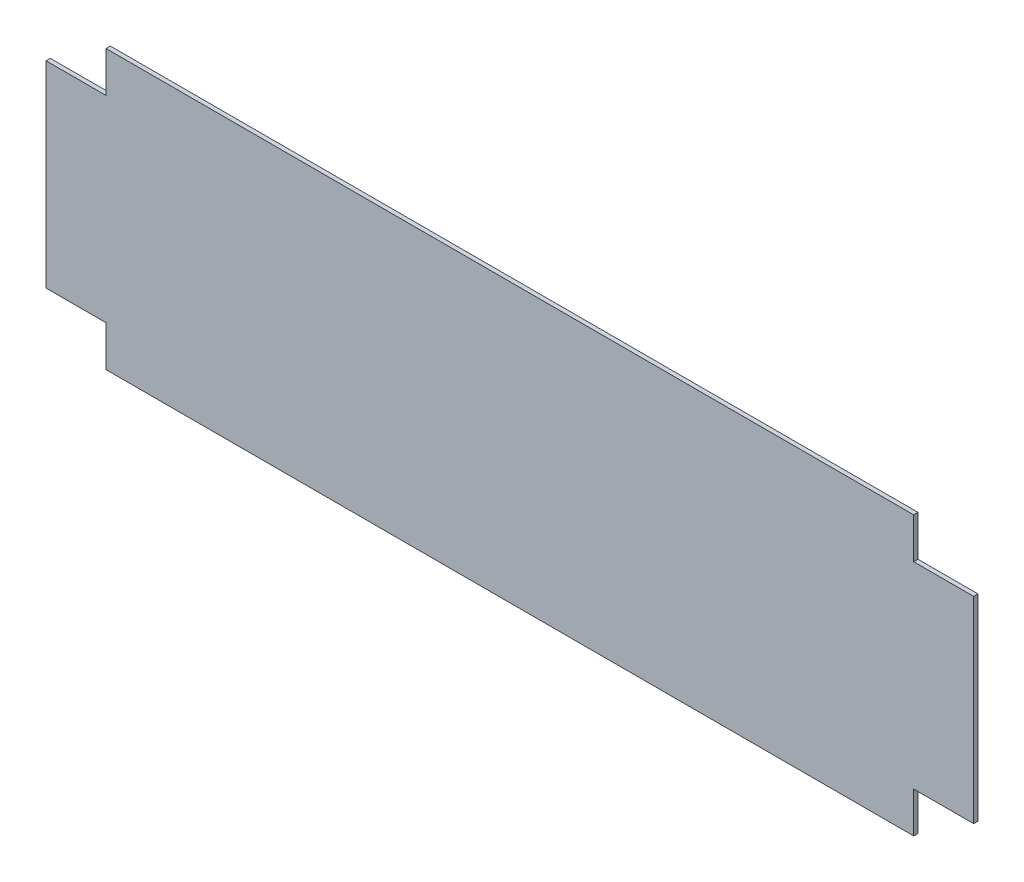
ISO-10303-21;
HEADER;
FILE_DESCRIPTION(('STEP AP214'),'2;1');
FILE_NAME('part.step','',(''),(''),'','','');
FILE_SCHEMA(('AUTOMOTIVE_DESIGN { 1 0 10303 214 1 1 1 1 }'));
ENDSEC;
DATA;
#1=APPLICATION_CONTEXT('core data for automotive mechanical design processes');
#2=APPLICATION_PROTOCOL_DEFINITION('international standard','automotive_design',2000,#1);
#3=PRODUCT_CONTEXT('',#1,'mechanical');
#4=PRODUCT('Part','Part','',(#3));
#5=PRODUCT_RELATED_PRODUCT_CATEGORY('part','',(#4));
#6=PRODUCT_DEFINITION_FORMATION('','',#4);
#7=PRODUCT_DEFINITION_CONTEXT('part definition',#1,'design');
#8=PRODUCT_DEFINITION('design','',#6,#7);
#9=PRODUCT_DEFINITION_SHAPE('','',#8);
#10=(LENGTH_UNIT() NAMED_UNIT(*) SI_UNIT(.MILLI.,.METRE.));
#11=(NAMED_UNIT(*) PLANE_ANGLE_UNIT() SI_UNIT($,.RADIAN.));
#12=(NAMED_UNIT(*) SI_UNIT($,.STERADIAN.) SOLID_ANGLE_UNIT());
#13=UNCERTAINTY_MEASURE_WITH_UNIT(LENGTH_MEASURE(1.E-05),#10,'distance_accuracy_value','');
#14=(GEOMETRIC_REPRESENTATION_CONTEXT(3) GLOBAL_UNCERTAINTY_ASSIGNED_CONTEXT((#13)) GLOBAL_UNIT_ASSIGNED_CONTEXT((#10,
#11,#12)) REPRESENTATION_CONTEXT('',''));
#15=CARTESIAN_POINT('',(0.,0.,0.));
#16=DIRECTION('',(0.,0.,1.));
#17=DIRECTION('',(1.,0.,0.));
#18=AXIS2_PLACEMENT_3D('',#15,#16,#17);
#19=CARTESIAN_POINT('',(-11.5250000000019,1.66533453693773E-13,2.));
#20=DIRECTION('',(1.,0.,0.));
#21=DIRECTION('',(0.,0.,-1.));
#22=AXIS2_PLACEMENT_3D('',#19,#20,#21);
#23=PLANE('',#22);
#24=DIRECTION('',(0.,-1.,0.));
#25=VECTOR('',#24,1.);
#26=CARTESIAN_POINT('',(-11.5250000000019,1.66533453693773E-13,0.));
#27=LINE('',#26,#25);
#28=CARTESIAN_POINT('',(-11.5250000000019,92.0974105023525,0.));
#29=VERTEX_POINT('',#28);
#30=CARTESIAN_POINT('',(-11.5250000000019,1.66533453693773E-13,0.));
#31=VERTEX_POINT('',#30);
#32=EDGE_CURVE('E153',#29,#31,#27,.T.);
#33=ORIENTED_EDGE('',*,*,#32,.T.);
#34=DIRECTION('',(0.,0.,-1.));
#35=VECTOR('',#34,1.);
#36=CARTESIAN_POINT('',(-11.5250000000019,1.66533453693773E-13,2.));
#37=LINE('',#36,#35);
#38=CARTESIAN_POINT('',(-11.5250000000019,1.66533453693773E-13,2.));
#39=VERTEX_POINT('',#38);
#40=EDGE_CURVE('E11',#39,#31,#37,.T.);
#41=ORIENTED_EDGE('',*,*,#40,.F.);
#42=DIRECTION('',(0.,-1.,0.));
#43=VECTOR('',#42,1.);
#44=CARTESIAN_POINT('',(-11.5250000000019,1.66533453693773E-13,2.));
#45=LINE('',#44,#43);
#46=CARTESIAN_POINT('',(-11.5250000000019,92.0974105023525,2.));
#47=VERTEX_POINT('',#46);
#48=EDGE_CURVE('E175',#47,#39,#45,.T.);
#49=ORIENTED_EDGE('',*,*,#48,.F.);
#50=DIRECTION('',(0.,0.,-1.));
#51=VECTOR('',#50,1.);
#52=CARTESIAN_POINT('',(-11.5250000000019,92.0974105023525,2.));
#53=LINE('',#52,#51);
#54=EDGE_CURVE('E149',#47,#29,#53,.T.);
#55=ORIENTED_EDGE('',*,*,#54,.T.);
#56=EDGE_LOOP('',(#33,#41,#49,#55));
#57=FACE_BOUND('',#56,.T.);
#58=ADVANCED_FACE('F33',(#57),#23,.F.);
#59=CARTESIAN_POINT('',(16.5520670792838,0.,2.));
#60=DIRECTION('',(0.,1.,0.));
#61=DIRECTION('',(-1.,0.,0.));
#62=AXIS2_PLACEMENT_3D('',#59,#60,#61);
#63=PLANE('',#62);
#64=DIRECTION('',(1.,0.,0.));
#65=VECTOR('',#64,1.);
#66=CARTESIAN_POINT('',(16.5520670792838,0.,0.));
#67=LINE('',#66,#65);
#68=CARTESIAN_POINT('',(16.5520670792838,0.,0.));
#69=VERTEX_POINT('',#68);
#70=EDGE_CURVE('E156',#31,#69,#67,.T.);
#71=ORIENTED_EDGE('',*,*,#70,.T.);
#72=DIRECTION('',(0.,0.,-1.));
#73=VECTOR('',#72,1.);
#74=CARTESIAN_POINT('',(16.5520670792838,0.,2.));
#75=LINE('',#74,#73);
#76=CARTESIAN_POINT('',(16.5520670792838,0.,2.));
#77=VERTEX_POINT('',#76);
#78=EDGE_CURVE('E41',#77,#69,#75,.T.);
#79=ORIENTED_EDGE('',*,*,#78,.F.);
#80=DIRECTION('',(1.,0.,0.));
#81=VECTOR('',#80,1.);
#82=CARTESIAN_POINT('',(16.5520670792838,0.,2.));
#83=LINE('',#82,#81);
#84=EDGE_CURVE('E104',#39,#77,#83,.T.);
#85=ORIENTED_EDGE('',*,*,#84,.F.);
#86=ORIENTED_EDGE('',*,*,#40,.T.);
#87=EDGE_LOOP('',(#71,#79,#85,#86));
#88=FACE_BOUND('',#87,.T.);
#89=ADVANCED_FACE('F253',(#88),#63,.F.);
#90=CARTESIAN_POINT('',(16.5520670792838,0.,2.));
#91=DIRECTION('',(1.,0.,0.));
#92=DIRECTION('',(0.,0.,-1.));
#93=AXIS2_PLACEMENT_3D('',#90,#91,#92);
#94=PLANE('',#93);
#95=DIRECTION('',(0.,-1.,0.));
#96=VECTOR('',#95,1.);
#97=CARTESIAN_POINT('',(16.5520670792838,0.,0.));
#98=LINE('',#97,#96);
#99=CARTESIAN_POINT('',(16.5520670792838,-19.0035951574496,0.));
#100=VERTEX_POINT('',#99);
#101=EDGE_CURVE('E158',#69,#100,#98,.T.);
#102=ORIENTED_EDGE('',*,*,#101,.T.);
#103=DIRECTION('',(0.,0.,-1.));
#104=VECTOR('',#103,1.);
#105=CARTESIAN_POINT('',(16.5520670792838,-19.0035951574496,2.));
#106=LINE('',#105,#104);
#107=CARTESIAN_POINT('',(16.5520670792838,-19.0035951574496,2.));
#108=VERTEX_POINT('',#107);
#109=EDGE_CURVE('E194',#108,#100,#106,.T.);
#110=ORIENTED_EDGE('',*,*,#109,.F.);
#111=DIRECTION('',(0.,-1.,0.));
#112=VECTOR('',#111,1.);
#113=CARTESIAN_POINT('',(16.5520670792838,0.,2.));
#114=LINE('',#113,#112);
#115=EDGE_CURVE('E202',#77,#108,#114,.T.);
#116=ORIENTED_EDGE('',*,*,#115,.F.);
#117=ORIENTED_EDGE('',*,*,#78,.T.);
#118=EDGE_LOOP('',(#102,#110,#116,#117));
#119=FACE_BOUND('',#118,.T.);
#120=ADVANCED_FACE('F200',(#119),#94,.F.);
#121=CARTESIAN_POINT('',(16.5520670792838,-19.0035951574496,2.));
#122=DIRECTION('',(0.,1.,0.));
#123=DIRECTION('',(-1.,0.,0.));
#124=AXIS2_PLACEMENT_3D('',#121,#122,#123);
#125=PLANE('',#124);
#126=DIRECTION('',(1.,0.,0.));
#127=VECTOR('',#126,1.);
#128=CARTESIAN_POINT('',(16.5520670792838,-19.0035951574496,0.));
#129=LINE('',#128,#127);
#130=CARTESIAN_POINT('',(394.397932920716,-19.0035951574495,0.));
#131=VERTEX_POINT('',#130);
#132=EDGE_CURVE('E160',#100,#131,#129,.T.);
#133=ORIENTED_EDGE('',*,*,#132,.T.);
#134=DIRECTION('',(0.,0.,-1.));
#135=VECTOR('',#134,1.);
#136=CARTESIAN_POINT('',(394.397932920716,-19.0035951574495,2.));
#137=LINE('',#136,#135);
#138=CARTESIAN_POINT('',(394.397932920716,-19.0035951574495,2.));
#139=VERTEX_POINT('',#138);
#140=EDGE_CURVE('E191',#139,#131,#137,.T.);
#141=ORIENTED_EDGE('',*,*,#140,.F.);
#142=DIRECTION('',(1.,0.,0.));
#143=VECTOR('',#142,1.);
#144=CARTESIAN_POINT('',(16.5520670792838,-19.0035951574496,2.));
#145=LINE('',#144,#143);
#146=EDGE_CURVE('E220',#108,#139,#145,.T.);
#147=ORIENTED_EDGE('',*,*,#146,.F.);
#148=ORIENTED_EDGE('',*,*,#109,.T.);
#149=EDGE_LOOP('',(#133,#141,#147,#148));
#150=FACE_BOUND('',#149,.T.);
#151=ADVANCED_FACE('F211',(#150),#125,.F.);
#152=CARTESIAN_POINT('',(394.397932920716,-19.0035951574495,2.));
#153=DIRECTION('',(-1.,0.,0.));
#154=DIRECTION('',(0.,0.,1.));
#155=AXIS2_PLACEMENT_3D('',#152,#153,#154);
#156=PLANE('',#155);
#157=DIRECTION('',(0.,1.,0.));
#158=VECTOR('',#157,1.);
#159=CARTESIAN_POINT('',(394.397932920716,-19.0035951574495,0.));
#160=LINE('',#159,#158);
#161=CARTESIAN_POINT('',(394.397932920716,1.47451495458029E-13,0.));
#162=VERTEX_POINT('',#161);
#163=EDGE_CURVE('E162',#131,#162,#160,.T.);
#164=ORIENTED_EDGE('',*,*,#163,.T.);
#165=DIRECTION('',(0.,0.,-1.));
#166=VECTOR('',#165,1.);
#167=CARTESIAN_POINT('',(394.397932920716,1.47451495458029E-13,2.));
#168=LINE('',#167,#166);
#169=CARTESIAN_POINT('',(394.397932920716,1.47451495458029E-13,2.));
#170=VERTEX_POINT('',#169);
#171=EDGE_CURVE('E188',#170,#162,#168,.T.);
#172=ORIENTED_EDGE('',*,*,#171,.F.);
#173=DIRECTION('',(0.,1.,0.));
#174=VECTOR('',#173,1.);
#175=CARTESIAN_POINT('',(394.397932920716,-19.0035951574495,2.));
#176=LINE('',#175,#174);
#177=EDGE_CURVE('E217',#139,#170,#176,.T.);
#178=ORIENTED_EDGE('',*,*,#177,.F.);
#179=ORIENTED_EDGE('',*,*,#140,.T.);
#180=EDGE_LOOP('',(#164,#172,#178,#179));
#181=FACE_BOUND('',#180,.T.);
#182=ADVANCED_FACE('F215',(#181),#156,.F.);
#183=CARTESIAN_POINT('',(422.475000000002,1.66533453693773E-13,2.));
#184=DIRECTION('',(0.,1.,0.));
#185=DIRECTION('',(-1.,0.,0.));
#186=AXIS2_PLACEMENT_3D('',#183,#184,#185);
#187=PLANE('',#186);
#188=DIRECTION('',(1.,0.,0.));
#189=VECTOR('',#188,1.);
#190=CARTESIAN_POINT('',(422.475000000002,1.66533453693773E-13,0.));
#191=LINE('',#190,#189);
#192=CARTESIAN_POINT('',(422.475000000002,1.66533453693773E-13,0.));
#193=VERTEX_POINT('',#192);
#194=EDGE_CURVE('E164',#162,#193,#191,.T.);
#195=ORIENTED_EDGE('',*,*,#194,.T.);
#196=DIRECTION('',(0.,0.,-1.));
#197=VECTOR('',#196,1.);
#198=CARTESIAN_POINT('',(422.475000000002,1.66533453693773E-13,2.));
#199=LINE('',#198,#197);
#200=CARTESIAN_POINT('',(422.475000000002,1.66533453693773E-13,2.));
#201=VERTEX_POINT('',#200);
#202=EDGE_CURVE('E185',#201,#193,#199,.T.);
#203=ORIENTED_EDGE('',*,*,#202,.F.);
#204=DIRECTION('',(1.,0.,0.));
#205=VECTOR('',#204,1.);
#206=CARTESIAN_POINT('',(422.475000000002,1.66533453693773E-13,2.));
#207=LINE('',#206,#205);
#208=EDGE_CURVE('E219',#170,#201,#207,.T.);
#209=ORIENTED_EDGE('',*,*,#208,.F.);
#210=ORIENTED_EDGE('',*,*,#171,.T.);
#211=EDGE_LOOP('',(#195,#203,#209,#210));
#212=FACE_BOUND('',#211,.T.);
#213=ADVANCED_FACE('F266',(#212),#187,.F.);
#214=CARTESIAN_POINT('',(422.475000000002,92.0974105023525,2.));
#215=DIRECTION('',(-1.,0.,0.));
#216=DIRECTION('',(0.,0.,1.));
#217=AXIS2_PLACEMENT_3D('',#214,#215,#216);
#218=PLANE('',#217);
#219=DIRECTION('',(0.,1.,0.));
#220=VECTOR('',#219,1.);
#221=CARTESIAN_POINT('',(422.475000000002,92.0974105023525,0.));
#222=LINE('',#221,#220);
#223=CARTESIAN_POINT('',(422.475000000002,92.0974105023525,0.));
#224=VERTEX_POINT('',#223);
#225=EDGE_CURVE('E166',#193,#224,#222,.T.);
#226=ORIENTED_EDGE('',*,*,#225,.T.);
#227=DIRECTION('',(0.,0.,-1.));
#228=VECTOR('',#227,1.);
#229=CARTESIAN_POINT('',(422.475000000002,92.0974105023525,2.));
#230=LINE('',#229,#228);
#231=CARTESIAN_POINT('',(422.475000000002,92.0974105023525,2.));
#232=VERTEX_POINT('',#231);
#233=EDGE_CURVE('E182',#232,#224,#230,.T.);
#234=ORIENTED_EDGE('',*,*,#233,.F.);
#235=DIRECTION('',(0.,1.,0.));
#236=VECTOR('',#235,1.);
#237=CARTESIAN_POINT('',(422.475000000002,92.0974105023525,2.));
#238=LINE('',#237,#236);
#239=EDGE_CURVE('E222',#201,#232,#238,.T.);
#240=ORIENTED_EDGE('',*,*,#239,.F.);
#241=ORIENTED_EDGE('',*,*,#202,.T.);
#242=EDGE_LOOP('',(#226,#234,#240,#241));
#243=FACE_BOUND('',#242,.T.);
#244=ADVANCED_FACE('F269',(#243),#218,.F.);
#245=CARTESIAN_POINT('',(394.397932920716,92.0974105023525,2.));
#246=DIRECTION('',(0.,-1.,0.));
#247=DIRECTION('',(1.,0.,0.));
#248=AXIS2_PLACEMENT_3D('',#245,#246,#247);
#249=PLANE('',#248);
#250=DIRECTION('',(-1.,0.,0.));
#251=VECTOR('',#250,1.);
#252=CARTESIAN_POINT('',(394.397932920716,92.0974105023525,0.));
#253=LINE('',#252,#251);
#254=CARTESIAN_POINT('',(394.397932920716,92.0974105023525,0.));
#255=VERTEX_POINT('',#254);
#256=EDGE_CURVE('E168',#224,#255,#253,.T.);
#257=ORIENTED_EDGE('',*,*,#256,.T.);
#258=DIRECTION('',(0.,0.,-1.));
#259=VECTOR('',#258,1.);
#260=CARTESIAN_POINT('',(394.397932920716,92.0974105023525,2.));
#261=LINE('',#260,#259);
#262=CARTESIAN_POINT('',(394.397932920716,92.0974105023525,2.));
#263=VERTEX_POINT('',#262);
#264=EDGE_CURVE('E179',#263,#255,#261,.T.);
#265=ORIENTED_EDGE('',*,*,#264,.F.);
#266=DIRECTION('',(-1.,0.,0.));
#267=VECTOR('',#266,1.);
#268=CARTESIAN_POINT('',(394.397932920716,92.0974105023525,2.));
#269=LINE('',#268,#267);
#270=EDGE_CURVE('E228',#232,#263,#269,.T.);
#271=ORIENTED_EDGE('',*,*,#270,.F.);
#272=ORIENTED_EDGE('',*,*,#233,.T.);
#273=EDGE_LOOP('',(#257,#265,#271,#272));
#274=FACE_BOUND('',#273,.T.);
#275=ADVANCED_FACE('F234',(#274),#249,.F.);
#276=CARTESIAN_POINT('',(394.397932920716,111.101005659802,2.));
#277=DIRECTION('',(-1.,0.,0.));
#278=DIRECTION('',(0.,0.,1.));
#279=AXIS2_PLACEMENT_3D('',#276,#277,#278);
#280=PLANE('',#279);
#281=DIRECTION('',(0.,1.,0.));
#282=VECTOR('',#281,1.);
#283=CARTESIAN_POINT('',(394.397932920716,111.101005659802,0.));
#284=LINE('',#283,#282);
#285=CARTESIAN_POINT('',(394.397932920716,111.101005659802,0.));
#286=VERTEX_POINT('',#285);
#287=EDGE_CURVE('E170',#255,#286,#284,.T.);
#288=ORIENTED_EDGE('',*,*,#287,.T.);
#289=DIRECTION('',(0.,0.,-1.));
#290=VECTOR('',#289,1.);
#291=CARTESIAN_POINT('',(394.397932920716,111.101005659802,2.));
#292=LINE('',#291,#290);
#293=CARTESIAN_POINT('',(394.397932920716,111.101005659802,2.));
#294=VERTEX_POINT('',#293);
#295=EDGE_CURVE('E144',#294,#286,#292,.T.);
#296=ORIENTED_EDGE('',*,*,#295,.F.);
#297=DIRECTION('',(0.,1.,0.));
#298=VECTOR('',#297,1.);
#299=CARTESIAN_POINT('',(394.397932920716,111.101005659802,2.));
#300=LINE('',#299,#298);
#301=EDGE_CURVE('E135',#263,#294,#300,.T.);
#302=ORIENTED_EDGE('',*,*,#301,.F.);
#303=ORIENTED_EDGE('',*,*,#264,.T.);
#304=EDGE_LOOP('',(#288,#296,#302,#303));
#305=FACE_BOUND('',#304,.T.);
#306=ADVANCED_FACE('F238',(#305),#280,.F.);
#307=CARTESIAN_POINT('',(16.5520670792837,111.101005659802,2.));
#308=DIRECTION('',(0.,-1.,0.));
#309=DIRECTION('',(1.,0.,0.));
#310=AXIS2_PLACEMENT_3D('',#307,#308,#309);
#311=PLANE('',#310);
#312=DIRECTION('',(-1.,0.,0.));
#313=VECTOR('',#312,1.);
#314=CARTESIAN_POINT('',(16.5520670792837,111.101005659802,0.));
#315=LINE('',#314,#313);
#316=CARTESIAN_POINT('',(16.5520670792837,111.101005659802,0.));
#317=VERTEX_POINT('',#316);
#318=EDGE_CURVE('E143',#286,#317,#315,.T.);
#319=ORIENTED_EDGE('',*,*,#318,.T.);
#320=DIRECTION('',(0.,0.,-1.));
#321=VECTOR('',#320,1.);
#322=CARTESIAN_POINT('',(16.5520670792837,111.101005659802,2.));
#323=LINE('',#322,#321);
#324=CARTESIAN_POINT('',(16.5520670792837,111.101005659802,2.));
#325=VERTEX_POINT('',#324);
#326=EDGE_CURVE('E140',#325,#317,#323,.T.);
#327=ORIENTED_EDGE('',*,*,#326,.F.);
#328=DIRECTION('',(-1.,0.,0.));
#329=VECTOR('',#328,1.);
#330=CARTESIAN_POINT('',(16.5520670792837,111.101005659802,2.));
#331=LINE('',#330,#329);
#332=EDGE_CURVE('E129',#294,#325,#331,.T.);
#333=ORIENTED_EDGE('',*,*,#332,.F.);
#334=ORIENTED_EDGE('',*,*,#295,.T.);
#335=EDGE_LOOP('',(#319,#327,#333,#334));
#336=FACE_BOUND('',#335,.T.);
#337=ADVANCED_FACE('F141',(#336),#311,.F.);
#338=CARTESIAN_POINT('',(16.5520670792837,92.0974105023526,2.));
#339=DIRECTION('',(1.,0.,0.));
#340=DIRECTION('',(0.,0.,-1.));
#341=AXIS2_PLACEMENT_3D('',#338,#339,#340);
#342=PLANE('',#341);
#343=DIRECTION('',(0.,-1.,0.));
#344=VECTOR('',#343,1.);
#345=CARTESIAN_POINT('',(16.5520670792837,92.0974105023526,0.));
#346=LINE('',#345,#344);
#347=CARTESIAN_POINT('',(16.5520670792837,92.0974105023526,0.));
#348=VERTEX_POINT('',#347);
#349=EDGE_CURVE('E90',#317,#348,#346,.T.);
#350=ORIENTED_EDGE('',*,*,#349,.T.);
#351=DIRECTION('',(0.,0.,-1.));
#352=VECTOR('',#351,1.);
#353=CARTESIAN_POINT('',(16.5520670792837,92.0974105023526,2.));
#354=LINE('',#353,#352);
#355=CARTESIAN_POINT('',(16.5520670792837,92.0974105023526,2.));
#356=VERTEX_POINT('',#355);
#357=EDGE_CURVE('E145',#356,#348,#354,.T.);
#358=ORIENTED_EDGE('',*,*,#357,.F.);
#359=DIRECTION('',(0.,-1.,0.));
#360=VECTOR('',#359,1.);
#361=CARTESIAN_POINT('',(16.5520670792837,92.0974105023526,2.));
#362=LINE('',#361,#360);
#363=EDGE_CURVE('E133',#325,#356,#362,.T.);
#364=ORIENTED_EDGE('',*,*,#363,.F.);
#365=ORIENTED_EDGE('',*,*,#326,.T.);
#366=EDGE_LOOP('',(#350,#358,#364,#365));
#367=FACE_BOUND('',#366,.T.);
#368=ADVANCED_FACE('F147',(#367),#342,.F.);
#369=CARTESIAN_POINT('',(-11.5250000000019,92.0974105023525,2.));
#370=DIRECTION('',(0.,-1.,0.));
#371=DIRECTION('',(1.,0.,0.));
#372=AXIS2_PLACEMENT_3D('',#369,#370,#371);
#373=PLANE('',#372);
#374=DIRECTION('',(-1.,0.,0.));
#375=VECTOR('',#374,1.);
#376=CARTESIAN_POINT('',(-11.5250000000019,92.0974105023525,0.));
#377=LINE('',#376,#375);
#378=EDGE_CURVE('E96',#348,#29,#377,.T.);
#379=ORIENTED_EDGE('',*,*,#378,.T.);
#380=ORIENTED_EDGE('',*,*,#54,.F.);
#381=DIRECTION('',(-1.,0.,0.));
#382=VECTOR('',#381,1.);
#383=CARTESIAN_POINT('',(-11.5250000000019,92.0974105023525,2.));
#384=LINE('',#383,#382);
#385=EDGE_CURVE('E49',#356,#47,#384,.T.);
#386=ORIENTED_EDGE('',*,*,#385,.F.);
#387=ORIENTED_EDGE('',*,*,#357,.T.);
#388=EDGE_LOOP('',(#379,#380,#386,#387));
#389=FACE_BOUND('',#388,.T.);
#390=ADVANCED_FACE('F242',(#389),#373,.F.);
#391=CARTESIAN_POINT('',(0.,0.,2.));
#392=DIRECTION('',(0.,0.,-1.));
#393=DIRECTION('',(-1.,0.,0.));
#394=AXIS2_PLACEMENT_3D('',#391,#392,#393);
#395=PLANE('',#394);
#396=ORIENTED_EDGE('',*,*,#48,.T.);
#397=ORIENTED_EDGE('',*,*,#84,.T.);
#398=ORIENTED_EDGE('',*,*,#115,.T.);
#399=ORIENTED_EDGE('',*,*,#146,.T.);
#400=ORIENTED_EDGE('',*,*,#177,.T.);
#401=ORIENTED_EDGE('',*,*,#208,.T.);
#402=ORIENTED_EDGE('',*,*,#239,.T.);
#403=ORIENTED_EDGE('',*,*,#270,.T.);
#404=ORIENTED_EDGE('',*,*,#301,.T.);
#405=ORIENTED_EDGE('',*,*,#332,.T.);
#406=ORIENTED_EDGE('',*,*,#363,.T.);
#407=ORIENTED_EDGE('',*,*,#385,.T.);
#408=EDGE_LOOP('',(#396,#397,#398,#399,#400,#401,#402,#403,#404,#405,#406,#407));
#409=FACE_BOUND('',#408,.T.);
#410=ADVANCED_FACE('F131',(#409),#395,.F.);
#411=CARTESIAN_POINT('',(0.,0.,0.));
#412=DIRECTION('',(0.,0.,-1.));
#413=DIRECTION('',(-1.,0.,0.));
#414=AXIS2_PLACEMENT_3D('',#411,#412,#413);
#415=PLANE('',#414);
#416=ORIENTED_EDGE('',*,*,#32,.F.);
#417=ORIENTED_EDGE('',*,*,#378,.F.);
#418=ORIENTED_EDGE('',*,*,#349,.F.);
#419=ORIENTED_EDGE('',*,*,#318,.F.);
#420=ORIENTED_EDGE('',*,*,#287,.F.);
#421=ORIENTED_EDGE('',*,*,#256,.F.);
#422=ORIENTED_EDGE('',*,*,#225,.F.);
#423=ORIENTED_EDGE('',*,*,#194,.F.);
#424=ORIENTED_EDGE('',*,*,#163,.F.);
#425=ORIENTED_EDGE('',*,*,#132,.F.);
#426=ORIENTED_EDGE('',*,*,#101,.F.);
#427=ORIENTED_EDGE('',*,*,#70,.F.);
#428=EDGE_LOOP('',(#416,#417,#418,#419,#420,#421,#422,#423,#424,#425,#426,#427));
#429=FACE_BOUND('',#428,.T.);
#430=ADVANCED_FACE('F206',(#429),#415,.T.);
#431=CLOSED_SHELL('',(#58,#89,#120,#151,#182,#213,#244,#275,#306,#337,#368,#390,#410,#430));
#432=MANIFOLD_SOLID_BREP('B2',#431);
#433=ADVANCED_BREP_SHAPE_REPRESENTATION('',(#18,#432),#14);
#434=SHAPE_DEFINITION_REPRESENTATION(#9,#433);
ENDSEC;
END-ISO-10303-21;
